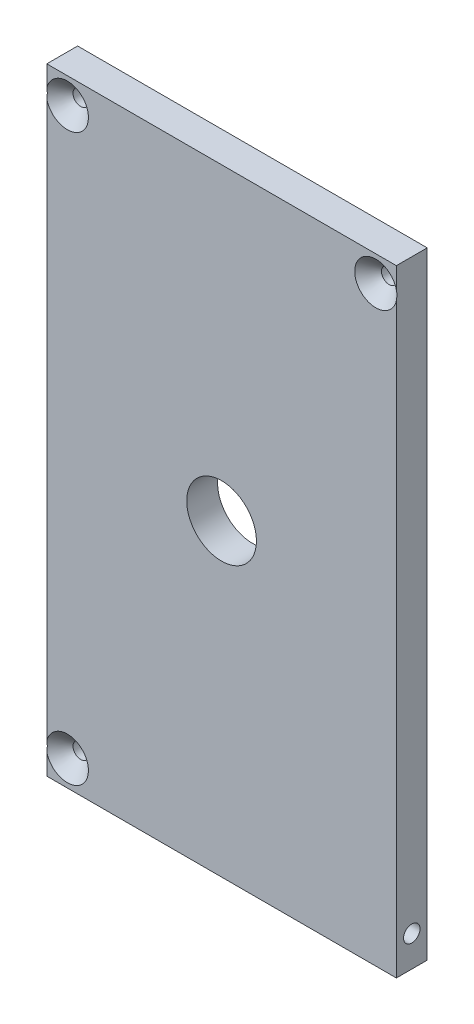
ISO-10303-21;
HEADER;
FILE_DESCRIPTION(('STEP AP214'),'2;1');
FILE_NAME('part.step','',(''),(''),'','','');
FILE_SCHEMA(('AUTOMOTIVE_DESIGN { 1 0 10303 214 1 1 1 1 }'));
ENDSEC;
DATA;
#1=APPLICATION_CONTEXT('core data for automotive mechanical design processes');
#2=APPLICATION_PROTOCOL_DEFINITION('international standard','automotive_design',2000,#1);
#3=PRODUCT_CONTEXT('',#1,'mechanical');
#4=PRODUCT('Part','Part','',(#3));
#5=PRODUCT_RELATED_PRODUCT_CATEGORY('part','',(#4));
#6=PRODUCT_DEFINITION_FORMATION('','',#4);
#7=PRODUCT_DEFINITION_CONTEXT('part definition',#1,'design');
#8=PRODUCT_DEFINITION('design','',#6,#7);
#9=PRODUCT_DEFINITION_SHAPE('','',#8);
#10=(LENGTH_UNIT() NAMED_UNIT(*) SI_UNIT(.MILLI.,.METRE.));
#11=(NAMED_UNIT(*) PLANE_ANGLE_UNIT() SI_UNIT($,.RADIAN.));
#12=(NAMED_UNIT(*) SI_UNIT($,.STERADIAN.) SOLID_ANGLE_UNIT());
#13=UNCERTAINTY_MEASURE_WITH_UNIT(LENGTH_MEASURE(1.E-05),#10,'distance_accuracy_value','');
#14=(GEOMETRIC_REPRESENTATION_CONTEXT(3) GLOBAL_UNCERTAINTY_ASSIGNED_CONTEXT((#13)) GLOBAL_UNIT_ASSIGNED_CONTEXT((#10,
#11,#12)) REPRESENTATION_CONTEXT('',''));
#15=CARTESIAN_POINT('',(0.,0.,0.));
#16=DIRECTION('',(0.,0.,1.));
#17=DIRECTION('',(1.,0.,0.));
#18=AXIS2_PLACEMENT_3D('',#15,#16,#17);
#19=CARTESIAN_POINT('',(0.,0.,3.));
#20=DIRECTION('',(0.,0.,-1.));
#21=DIRECTION('',(-1.,0.,0.));
#22=AXIS2_PLACEMENT_3D('',#19,#20,#21);
#23=PLANE('',#22);
#24=DIRECTION('',(0.,-1.,0.));
#25=VECTOR('',#24,1.);
#26=CARTESIAN_POINT('',(-17.,-30.,3.));
#27=LINE('',#26,#25);
#28=CARTESIAN_POINT('',(-17.,27.0499999999999,3.));
#29=VERTEX_POINT('',#28);
#30=CARTESIAN_POINT('',(-17.,-27.05,3.));
#31=VERTEX_POINT('',#30);
#32=EDGE_CURVE('E245',#29,#31,#27,.T.);
#33=ORIENTED_EDGE('',*,*,#32,.T.);
#34=CARTESIAN_POINT('',(-15.,-27.5,3.));
#35=DIRECTION('',(0.,0.,-1.));
#36=DIRECTION('',(-1.,0.,0.));
#37=AXIS2_PLACEMENT_3D('',#34,#35,#36);
#38=CIRCLE('',#37,2.05000000000001);
#39=CARTESIAN_POINT('',(-17.,-27.95,3.));
#40=VERTEX_POINT('',#39);
#41=EDGE_CURVE('E137',#31,#40,#38,.T.);
#42=ORIENTED_EDGE('',*,*,#41,.T.);
#43=CARTESIAN_POINT('',(-17.,-30.,3.));
#44=VERTEX_POINT('',#43);
#45=EDGE_CURVE('E119',#40,#44,#27,.T.);
#46=ORIENTED_EDGE('',*,*,#45,.T.);
#47=DIRECTION('',(1.,0.,0.));
#48=VECTOR('',#47,1.);
#49=CARTESIAN_POINT('',(-17.,-30.,3.));
#50=LINE('',#49,#48);
#51=CARTESIAN_POINT('',(17.,-30.,3.));
#52=VERTEX_POINT('',#51);
#53=EDGE_CURVE('E244',#44,#52,#50,.T.);
#54=ORIENTED_EDGE('',*,*,#53,.T.);
#55=DIRECTION('',(0.,1.,0.));
#56=VECTOR('',#55,1.);
#57=CARTESIAN_POINT('',(17.,-30.,3.));
#58=LINE('',#57,#56);
#59=CARTESIAN_POINT('',(17.,27.0499999999999,3.));
#60=VERTEX_POINT('',#59);
#61=EDGE_CURVE('E108',#52,#60,#58,.T.);
#62=ORIENTED_EDGE('',*,*,#61,.T.);
#63=CARTESIAN_POINT('',(15.,27.5,3.));
#64=DIRECTION('',(0.,0.,-1.));
#65=DIRECTION('',(-1.,0.,0.));
#66=AXIS2_PLACEMENT_3D('',#63,#64,#65);
#67=CIRCLE('',#66,2.05000000000001);
#68=CARTESIAN_POINT('',(17.,27.9500000000001,3.));
#69=VERTEX_POINT('',#68);
#70=EDGE_CURVE('E105',#60,#69,#67,.T.);
#71=ORIENTED_EDGE('',*,*,#70,.T.);
#72=CARTESIAN_POINT('',(17.,30.,3.));
#73=VERTEX_POINT('',#72);
#74=EDGE_CURVE('E97',#69,#73,#58,.T.);
#75=ORIENTED_EDGE('',*,*,#74,.T.);
#76=DIRECTION('',(-1.,0.,0.));
#77=VECTOR('',#76,1.);
#78=CARTESIAN_POINT('',(-17.,30.,3.));
#79=LINE('',#78,#77);
#80=CARTESIAN_POINT('',(-17.,30.,3.));
#81=VERTEX_POINT('',#80);
#82=EDGE_CURVE('E101',#73,#81,#79,.T.);
#83=ORIENTED_EDGE('',*,*,#82,.T.);
#84=CARTESIAN_POINT('',(-17.,27.9500000000001,3.));
#85=VERTEX_POINT('',#84);
#86=EDGE_CURVE('E242',#81,#85,#27,.T.);
#87=ORIENTED_EDGE('',*,*,#86,.T.);
#88=CARTESIAN_POINT('',(-15.,27.5,3.));
#89=DIRECTION('',(0.,0.,-1.));
#90=DIRECTION('',(-1.,0.,0.));
#91=AXIS2_PLACEMENT_3D('',#88,#89,#90);
#92=CIRCLE('',#91,2.05000000000001);
#93=EDGE_CURVE('E128',#85,#29,#92,.T.);
#94=ORIENTED_EDGE('',*,*,#93,.T.);
#95=EDGE_LOOP('',(#33,#42,#46,#54,#62,#71,#75,#83,#87,#94));
#96=FACE_BOUND('',#95,.T.);
#97=CARTESIAN_POINT('',(0.,0.,3.));
#98=DIRECTION('',(0.,0.,1.));
#99=DIRECTION('',(1.,0.,0.));
#100=AXIS2_PLACEMENT_3D('',#97,#98,#99);
#101=CIRCLE('',#100,3.39);
#102=CARTESIAN_POINT('',(3.38999999999999,0.,3.));
#103=VERTEX_POINT('',#102);
#104=EDGE_CURVE('E237',#103,#103,#101,.T.);
#105=ORIENTED_EDGE('',*,*,#104,.F.);
#106=EDGE_LOOP('',(#105));
#107=FACE_BOUND('',#106,.T.);
#108=ADVANCED_FACE('F36',(#96,#107),#23,.F.);
#109=CARTESIAN_POINT('',(0.,0.,0.));
#110=DIRECTION('',(0.,0.,-1.));
#111=DIRECTION('',(-1.,0.,0.));
#112=AXIS2_PLACEMENT_3D('',#109,#110,#111);
#113=PLANE('',#112);
#114=CARTESIAN_POINT('',(-15.,27.5,0.));
#115=DIRECTION('',(0.,0.,1.));
#116=DIRECTION('',(-1.,0.,0.));
#117=AXIS2_PLACEMENT_3D('',#114,#115,#116);
#118=CIRCLE('',#117,0.75);
#119=CARTESIAN_POINT('',(-15.75,27.5,0.));
#120=VERTEX_POINT('',#119);
#121=EDGE_CURVE('E226',#120,#120,#118,.T.);
#122=ORIENTED_EDGE('',*,*,#121,.T.);
#123=EDGE_LOOP('',(#122));
#124=FACE_BOUND('',#123,.T.);
#125=CARTESIAN_POINT('',(0.,0.,0.));
#126=DIRECTION('',(0.,0.,1.));
#127=DIRECTION('',(1.,0.,0.));
#128=AXIS2_PLACEMENT_3D('',#125,#126,#127);
#129=CIRCLE('',#128,3.39);
#130=CARTESIAN_POINT('',(3.38999999999999,0.,0.));
#131=VERTEX_POINT('',#130);
#132=EDGE_CURVE('E236',#131,#131,#129,.T.);
#133=ORIENTED_EDGE('',*,*,#132,.T.);
#134=EDGE_LOOP('',(#133));
#135=FACE_BOUND('',#134,.T.);
#136=DIRECTION('',(0.,1.,0.));
#137=VECTOR('',#136,1.);
#138=CARTESIAN_POINT('',(17.,-30.,0.));
#139=LINE('',#138,#137);
#140=CARTESIAN_POINT('',(17.,-30.,0.));
#141=VERTEX_POINT('',#140);
#142=CARTESIAN_POINT('',(17.,30.,0.));
#143=VERTEX_POINT('',#142);
#144=EDGE_CURVE('E124',#141,#143,#139,.T.);
#145=ORIENTED_EDGE('',*,*,#144,.F.);
#146=DIRECTION('',(1.,0.,0.));
#147=VECTOR('',#146,1.);
#148=CARTESIAN_POINT('',(-17.,-30.,0.));
#149=LINE('',#148,#147);
#150=CARTESIAN_POINT('',(-17.,-30.,0.));
#151=VERTEX_POINT('',#150);
#152=EDGE_CURVE('E109',#151,#141,#149,.T.);
#153=ORIENTED_EDGE('',*,*,#152,.F.);
#154=DIRECTION('',(0.,-1.,0.));
#155=VECTOR('',#154,1.);
#156=CARTESIAN_POINT('',(-17.,-30.,0.));
#157=LINE('',#156,#155);
#158=CARTESIAN_POINT('',(-17.,30.,0.));
#159=VERTEX_POINT('',#158);
#160=EDGE_CURVE('E251',#159,#151,#157,.T.);
#161=ORIENTED_EDGE('',*,*,#160,.F.);
#162=DIRECTION('',(-1.,0.,0.));
#163=VECTOR('',#162,1.);
#164=CARTESIAN_POINT('',(-17.,30.,0.));
#165=LINE('',#164,#163);
#166=EDGE_CURVE('E249',#143,#159,#165,.T.);
#167=ORIENTED_EDGE('',*,*,#166,.F.);
#168=EDGE_LOOP('',(#145,#153,#161,#167));
#169=FACE_BOUND('',#168,.T.);
#170=CARTESIAN_POINT('',(-15.,-27.5,0.));
#171=DIRECTION('',(0.,0.,1.));
#172=DIRECTION('',(1.,0.,0.));
#173=AXIS2_PLACEMENT_3D('',#170,#171,#172);
#174=CIRCLE('',#173,0.75);
#175=CARTESIAN_POINT('',(-14.25,-27.5,0.));
#176=VERTEX_POINT('',#175);
#177=EDGE_CURVE('E233',#176,#176,#174,.T.);
#178=ORIENTED_EDGE('',*,*,#177,.T.);
#179=EDGE_LOOP('',(#178));
#180=FACE_BOUND('',#179,.T.);
#181=CARTESIAN_POINT('',(15.,27.5,0.));
#182=DIRECTION('',(0.,0.,1.));
#183=DIRECTION('',(1.,0.,0.));
#184=AXIS2_PLACEMENT_3D('',#181,#182,#183);
#185=CIRCLE('',#184,0.75);
#186=CARTESIAN_POINT('',(15.75,27.5,0.));
#187=VERTEX_POINT('',#186);
#188=EDGE_CURVE('E222',#187,#187,#185,.T.);
#189=ORIENTED_EDGE('',*,*,#188,.T.);
#190=EDGE_LOOP('',(#189));
#191=FACE_BOUND('',#190,.T.);
#192=ADVANCED_FACE('F164',(#124,#135,#169,#180,#191),#113,.T.);
#193=CARTESIAN_POINT('',(17.,-30.,3.));
#194=DIRECTION('',(-1.,0.,0.));
#195=DIRECTION('',(0.,0.,1.));
#196=AXIS2_PLACEMENT_3D('',#193,#194,#195);
#197=PLANE('',#196);
#198=CARTESIAN_POINT('',(17.,-27.,1.5));
#199=DIRECTION('',(1.,0.,0.));
#200=DIRECTION('',(0.,0.,-1.));
#201=AXIS2_PLACEMENT_3D('',#198,#199,#200);
#202=CIRCLE('',#201,0.8);
#203=CARTESIAN_POINT('',(17.,-27.,0.7));
#204=VERTEX_POINT('',#203);
#205=EDGE_CURVE('E223',#204,#204,#202,.T.);
#206=ORIENTED_EDGE('',*,*,#205,.F.);
#207=EDGE_LOOP('',(#206));
#208=FACE_BOUND('',#207,.T.);
#209=ORIENTED_EDGE('',*,*,#74,.F.);
#210=CARTESIAN_POINT('',(17.,27.95,3.));
#211=CARTESIAN_POINT('',(17.,27.9000685400382,2.98901849951887));
#212=CARTESIAN_POINT('',(17.,27.8497477334455,2.97972833695772));
#213=CARTESIAN_POINT('',(17.,27.7485458265428,2.96476856684088));
#214=CARTESIAN_POINT('',(17.,27.6976644419788,2.95910089105741));
#215=CARTESIAN_POINT('',(17.,27.5964302828424,2.95169593710115));
#216=CARTESIAN_POINT('',(17.,27.54608208399,2.9498971967524));
#217=CARTESIAN_POINT('',(17.,27.4454171247625,2.95011183607295));
#218=CARTESIAN_POINT('',(17.,27.3951003606592,2.95212344249394));
#219=CARTESIAN_POINT('',(17.,27.2955374393054,2.95982175365742));
#220=CARTESIAN_POINT('',(17.,27.2462867587234,2.96545114549164));
#221=CARTESIAN_POINT('',(17.,27.1478982100575,2.9801651706584));
#222=CARTESIAN_POINT('',(17.,27.0987644099892,2.98927713592593));
#223=CARTESIAN_POINT('',(17.,27.0499999999999,3.));
#224=B_SPLINE_CURVE_WITH_KNOTS('',3,(#210,#211,#212,#213,#214,#215,#216,#217,#218,#219,#220,
#221,#222,#223),.UNSPECIFIED.,.F.,.F.,(4,2,2,2,2,2,4),(0.,0.153371007216202,0.306823734867596,
0.457820124395752,0.608746260919221,0.757338469943982,0.907121637036547),.UNSPECIFIED.);
#225=EDGE_CURVE('E46',#69,#60,#224,.T.);
#226=ORIENTED_EDGE('',*,*,#225,.T.);
#227=ORIENTED_EDGE('',*,*,#61,.F.);
#228=DIRECTION('',(0.,0.,-1.));
#229=VECTOR('',#228,1.);
#230=CARTESIAN_POINT('',(17.,-30.,3.));
#231=LINE('',#230,#229);
#232=EDGE_CURVE('E247',#52,#141,#231,.T.);
#233=ORIENTED_EDGE('',*,*,#232,.T.);
#234=ORIENTED_EDGE('',*,*,#144,.T.);
#235=DIRECTION('',(0.,0.,-1.));
#236=VECTOR('',#235,1.);
#237=CARTESIAN_POINT('',(17.,30.,3.));
#238=LINE('',#237,#236);
#239=EDGE_CURVE('E114',#73,#143,#238,.T.);
#240=ORIENTED_EDGE('',*,*,#239,.F.);
#241=EDGE_LOOP('',(#209,#226,#227,#233,#234,#240));
#242=FACE_BOUND('',#241,.T.);
#243=ADVANCED_FACE('F121',(#208,#242),#197,.F.);
#244=CARTESIAN_POINT('',(-17.,30.,3.));
#245=DIRECTION('',(0.,-1.,0.));
#246=DIRECTION('',(0.,0.,-1.));
#247=AXIS2_PLACEMENT_3D('',#244,#245,#246);
#248=PLANE('',#247);
#249=ORIENTED_EDGE('',*,*,#166,.T.);
#250=DIRECTION('',(0.,0.,-1.));
#251=VECTOR('',#250,1.);
#252=CARTESIAN_POINT('',(-17.,30.,3.));
#253=LINE('',#252,#251);
#254=EDGE_CURVE('E117',#81,#159,#253,.T.);
#255=ORIENTED_EDGE('',*,*,#254,.F.);
#256=ORIENTED_EDGE('',*,*,#82,.F.);
#257=ORIENTED_EDGE('',*,*,#239,.T.);
#258=EDGE_LOOP('',(#249,#255,#256,#257));
#259=FACE_BOUND('',#258,.T.);
#260=ADVANCED_FACE('F113',(#259),#248,.F.);
#261=CARTESIAN_POINT('',(-17.,-30.,3.));
#262=DIRECTION('',(1.,0.,0.));
#263=DIRECTION('',(0.,0.,-1.));
#264=AXIS2_PLACEMENT_3D('',#261,#262,#263);
#265=PLANE('',#264);
#266=ORIENTED_EDGE('',*,*,#45,.F.);
#267=CARTESIAN_POINT('',(-17.,-27.95,3.));
#268=CARTESIAN_POINT('',(-17.,-27.9000685400382,2.98901849951887));
#269=CARTESIAN_POINT('',(-17.,-27.8497477334455,2.97972833695772));
#270=CARTESIAN_POINT('',(-17.,-27.7485458265428,2.96476856684087));
#271=CARTESIAN_POINT('',(-17.,-27.6976644419787,2.95910089105741));
#272=CARTESIAN_POINT('',(-17.,-27.5964302828424,2.95169593710115));
#273=CARTESIAN_POINT('',(-17.,-27.54608208399,2.9498971967524));
#274=CARTESIAN_POINT('',(-17.,-27.4454171247625,2.95011183607295));
#275=CARTESIAN_POINT('',(-17.,-27.3951003606592,2.95212344249394));
#276=CARTESIAN_POINT('',(-17.,-27.2955374393054,2.95982175365742));
#277=CARTESIAN_POINT('',(-17.,-27.2462867587234,2.96545114549164));
#278=CARTESIAN_POINT('',(-17.,-27.1478982100575,2.9801651706584));
#279=CARTESIAN_POINT('',(-17.,-27.0987644099892,2.98927713592593));
#280=CARTESIAN_POINT('',(-17.,-27.05,3.));
#281=B_SPLINE_CURVE_WITH_KNOTS('',3,(#267,#268,#269,#270,#271,#272,#273,#274,#275,#276,#277,
#278,#279,#280),.UNSPECIFIED.,.F.,.F.,(4,2,2,2,2,2,4),(0.,0.153371007216206,0.3068237348676,
0.457820124395752,0.608746260919225,0.757338469943965,0.907121637036512),.UNSPECIFIED.);
#282=EDGE_CURVE('E52',#40,#31,#281,.T.);
#283=ORIENTED_EDGE('',*,*,#282,.T.);
#284=ORIENTED_EDGE('',*,*,#32,.F.);
#285=CARTESIAN_POINT('',(-17.,27.0499999999999,3.));
#286=CARTESIAN_POINT('',(-17.,27.0999314599618,2.98901849951887));
#287=CARTESIAN_POINT('',(-17.,27.1502522665545,2.97972833695772));
#288=CARTESIAN_POINT('',(-17.,27.2514541734572,2.96476856684087));
#289=CARTESIAN_POINT('',(-17.,27.3023355580212,2.95910089105741));
#290=CARTESIAN_POINT('',(-17.,27.4035697171576,2.95169593710115));
#291=CARTESIAN_POINT('',(-17.,27.45391791601,2.9498971967524));
#292=CARTESIAN_POINT('',(-17.,27.5545828752374,2.95011183607295));
#293=CARTESIAN_POINT('',(-17.,27.6048996393408,2.95212344249394));
#294=CARTESIAN_POINT('',(-17.,27.7044625606946,2.95982175365742));
#295=CARTESIAN_POINT('',(-17.,27.7537132412766,2.96545114549164));
#296=CARTESIAN_POINT('',(-17.,27.8521017899425,2.9801651706584));
#297=CARTESIAN_POINT('',(-17.,27.9012355900108,2.98927713592593));
#298=CARTESIAN_POINT('',(-17.,27.95,3.));
#299=B_SPLINE_CURVE_WITH_KNOTS('',3,(#285,#286,#287,#288,#289,#290,#291,#292,#293,#294,#295,
#296,#297,#298),.UNSPECIFIED.,.F.,.F.,(4,2,2,2,2,2,4),(0.,0.153371007216202,0.3068237348676,
0.457820124395749,0.608746260919221,0.757338469943982,0.907121637036547),.UNSPECIFIED.);
#300=EDGE_CURVE('E139',#29,#85,#299,.T.);
#301=ORIENTED_EDGE('',*,*,#300,.T.);
#302=ORIENTED_EDGE('',*,*,#86,.F.);
#303=ORIENTED_EDGE('',*,*,#254,.T.);
#304=ORIENTED_EDGE('',*,*,#160,.T.);
#305=DIRECTION('',(0.,0.,-1.));
#306=VECTOR('',#305,1.);
#307=CARTESIAN_POINT('',(-17.,-30.,3.));
#308=LINE('',#307,#306);
#309=EDGE_CURVE('E130',#44,#151,#308,.T.);
#310=ORIENTED_EDGE('',*,*,#309,.F.);
#311=EDGE_LOOP('',(#266,#283,#284,#301,#302,#303,#304,#310));
#312=FACE_BOUND('',#311,.T.);
#313=ADVANCED_FACE('F152',(#312),#265,.F.);
#314=CARTESIAN_POINT('',(-17.,-30.,3.));
#315=DIRECTION('',(0.,1.,0.));
#316=DIRECTION('',(0.,0.,1.));
#317=AXIS2_PLACEMENT_3D('',#314,#315,#316);
#318=PLANE('',#317);
#319=ORIENTED_EDGE('',*,*,#152,.T.);
#320=ORIENTED_EDGE('',*,*,#232,.F.);
#321=ORIENTED_EDGE('',*,*,#53,.F.);
#322=ORIENTED_EDGE('',*,*,#309,.T.);
#323=EDGE_LOOP('',(#319,#320,#321,#322));
#324=FACE_BOUND('',#323,.T.);
#325=ADVANCED_FACE('F157',(#324),#318,.F.);
#326=CARTESIAN_POINT('',(0.,0.,3.));
#327=DIRECTION('',(0.,0.,-1.));
#328=DIRECTION('',(-1.,0.,0.));
#329=AXIS2_PLACEMENT_3D('',#326,#327,#328);
#330=CYLINDRICAL_SURFACE('',#329,3.39);
#331=ORIENTED_EDGE('',*,*,#104,.T.);
#332=EDGE_LOOP('',(#331));
#333=FACE_BOUND('',#332,.T.);
#334=ORIENTED_EDGE('',*,*,#132,.F.);
#335=EDGE_LOOP('',(#334));
#336=FACE_BOUND('',#335,.T.);
#337=ADVANCED_FACE('F196',(#333,#336),#330,.F.);
#338=CARTESIAN_POINT('',(-15.,-27.5,3.));
#339=DIRECTION('',(0.,0.,-1.));
#340=DIRECTION('',(-1.,0.,0.));
#341=AXIS2_PLACEMENT_3D('',#338,#339,#340);
#342=CYLINDRICAL_SURFACE('',#341,0.75);
#343=CARTESIAN_POINT('',(-15.,-27.5,1.69999999999998));
#344=DIRECTION('',(0.,0.,-1.));
#345=DIRECTION('',(-1.,0.,0.));
#346=AXIS2_PLACEMENT_3D('',#343,#344,#345);
#347=CIRCLE('',#346,0.75);
#348=CARTESIAN_POINT('',(-15.75,-27.5,1.69999999999998));
#349=VERTEX_POINT('',#348);
#350=EDGE_CURVE('E125',#349,#349,#347,.F.);
#351=ORIENTED_EDGE('',*,*,#350,.T.);
#352=EDGE_LOOP('',(#351));
#353=FACE_BOUND('',#352,.T.);
#354=ORIENTED_EDGE('',*,*,#177,.F.);
#355=EDGE_LOOP('',(#354));
#356=FACE_BOUND('',#355,.T.);
#357=ADVANCED_FACE('F199',(#353,#356),#342,.F.);
#358=CARTESIAN_POINT('',(-15.,27.5,3.));
#359=DIRECTION('',(0.,0.,-1.));
#360=DIRECTION('',(-1.,0.,0.));
#361=AXIS2_PLACEMENT_3D('',#358,#359,#360);
#362=CYLINDRICAL_SURFACE('',#361,0.75);
#363=CARTESIAN_POINT('',(-15.,27.5,1.69999999999999));
#364=DIRECTION('',(0.,0.,-1.));
#365=DIRECTION('',(-1.,0.,0.));
#366=AXIS2_PLACEMENT_3D('',#363,#364,#365);
#367=CIRCLE('',#366,0.75);
#368=CARTESIAN_POINT('',(-15.75,27.5,1.69999999999999));
#369=VERTEX_POINT('',#368);
#370=EDGE_CURVE('E11',#369,#369,#367,.F.);
#371=ORIENTED_EDGE('',*,*,#370,.T.);
#372=EDGE_LOOP('',(#371));
#373=FACE_BOUND('',#372,.T.);
#374=ORIENTED_EDGE('',*,*,#121,.F.);
#375=EDGE_LOOP('',(#374));
#376=FACE_BOUND('',#375,.T.);
#377=ADVANCED_FACE('F203',(#373,#376),#362,.F.);
#378=CARTESIAN_POINT('',(15.,27.5,3.));
#379=DIRECTION('',(0.,0.,-1.));
#380=DIRECTION('',(-1.,0.,0.));
#381=AXIS2_PLACEMENT_3D('',#378,#379,#380);
#382=CYLINDRICAL_SURFACE('',#381,0.75);
#383=CARTESIAN_POINT('',(15.,27.5,1.69999999999999));
#384=DIRECTION('',(0.,0.,-1.));
#385=DIRECTION('',(-1.,0.,0.));
#386=AXIS2_PLACEMENT_3D('',#383,#384,#385);
#387=CIRCLE('',#386,0.75);
#388=CARTESIAN_POINT('',(14.25,27.5,1.69999999999999));
#389=VERTEX_POINT('',#388);
#390=EDGE_CURVE('E173',#389,#389,#387,.F.);
#391=ORIENTED_EDGE('',*,*,#390,.T.);
#392=EDGE_LOOP('',(#391));
#393=FACE_BOUND('',#392,.T.);
#394=ORIENTED_EDGE('',*,*,#188,.F.);
#395=EDGE_LOOP('',(#394));
#396=FACE_BOUND('',#395,.T.);
#397=ADVANCED_FACE('F187',(#393,#396),#382,.F.);
#398=CARTESIAN_POINT('',(-15.,-27.5,1.69999999999998));
#399=DIRECTION('',(0.,0.,1.));
#400=DIRECTION('',(1.,0.,0.));
#401=AXIS2_PLACEMENT_3D('',#398,#399,#400);
#402=CONICAL_SURFACE('',#401,0.75,0.785398163397443);
#403=ORIENTED_EDGE('',*,*,#282,.F.);
#404=ORIENTED_EDGE('',*,*,#41,.F.);
#405=EDGE_LOOP('',(#403,#404));
#406=FACE_BOUND('',#405,.T.);
#407=ORIENTED_EDGE('',*,*,#350,.F.);
#408=EDGE_LOOP('',(#407));
#409=FACE_BOUND('',#408,.T.);
#410=ADVANCED_FACE('F167',(#406,#409),#402,.F.);
#411=CARTESIAN_POINT('',(15.,27.5,1.69999999999999));
#412=DIRECTION('',(0.,0.,1.));
#413=DIRECTION('',(1.,0.,0.));
#414=AXIS2_PLACEMENT_3D('',#411,#412,#413);
#415=CONICAL_SURFACE('',#414,0.75,0.78539816339745);
#416=ORIENTED_EDGE('',*,*,#225,.F.);
#417=ORIENTED_EDGE('',*,*,#70,.F.);
#418=EDGE_LOOP('',(#416,#417));
#419=FACE_BOUND('',#418,.T.);
#420=ORIENTED_EDGE('',*,*,#390,.F.);
#421=EDGE_LOOP('',(#420));
#422=FACE_BOUND('',#421,.T.);
#423=ADVANCED_FACE('F175',(#419,#422),#415,.F.);
#424=CARTESIAN_POINT('',(-15.,27.5,1.69999999999999));
#425=DIRECTION('',(0.,0.,1.));
#426=DIRECTION('',(1.,0.,0.));
#427=AXIS2_PLACEMENT_3D('',#424,#425,#426);
#428=CONICAL_SURFACE('',#427,0.75,0.78539816339745);
#429=ORIENTED_EDGE('',*,*,#300,.F.);
#430=ORIENTED_EDGE('',*,*,#93,.F.);
#431=EDGE_LOOP('',(#429,#430));
#432=FACE_BOUND('',#431,.T.);
#433=ORIENTED_EDGE('',*,*,#370,.F.);
#434=EDGE_LOOP('',(#433));
#435=FACE_BOUND('',#434,.T.);
#436=ADVANCED_FACE('F39',(#432,#435),#428,.F.);
#437=CARTESIAN_POINT('',(14.,-27.,1.5));
#438=DIRECTION('',(1.,0.,0.));
#439=DIRECTION('',(0.,0.,-1.));
#440=AXIS2_PLACEMENT_3D('',#437,#438,#439);
#441=CYLINDRICAL_SURFACE('',#440,0.8);
#442=CARTESIAN_POINT('',(14.,-27.,1.5));
#443=DIRECTION('',(1.,0.,0.));
#444=DIRECTION('',(0.,0.,-1.));
#445=AXIS2_PLACEMENT_3D('',#442,#443,#444);
#446=CIRCLE('',#445,0.8);
#447=CARTESIAN_POINT('',(14.,-27.,0.7));
#448=VERTEX_POINT('',#447);
#449=EDGE_CURVE('E221',#448,#448,#446,.T.);
#450=ORIENTED_EDGE('',*,*,#449,.F.);
#451=EDGE_LOOP('',(#450));
#452=FACE_BOUND('',#451,.T.);
#453=ORIENTED_EDGE('',*,*,#205,.T.);
#454=EDGE_LOOP('',(#453));
#455=FACE_BOUND('',#454,.T.);
#456=ADVANCED_FACE('F185',(#452,#455),#441,.F.);
#457=CARTESIAN_POINT('',(14.,-27.,1.5));
#458=DIRECTION('',(1.,0.,0.));
#459=DIRECTION('',(0.,0.,-1.));
#460=AXIS2_PLACEMENT_3D('',#457,#458,#459);
#461=PLANE('',#460);
#462=ORIENTED_EDGE('',*,*,#449,.T.);
#463=EDGE_LOOP('',(#462));
#464=FACE_BOUND('',#463,.T.);
#465=ADVANCED_FACE('F213',(#464),#461,.T.);
#466=CLOSED_SHELL('',(#108,#192,#243,#260,#313,#325,#337,#357,#377,#397,#410,#423,#436,#456,#465));
#467=MANIFOLD_SOLID_BREP('B2',#466);
#468=ADVANCED_BREP_SHAPE_REPRESENTATION('',(#18,#467),#14);
#469=SHAPE_DEFINITION_REPRESENTATION(#9,#468);
ENDSEC;
END-ISO-10303-21;
